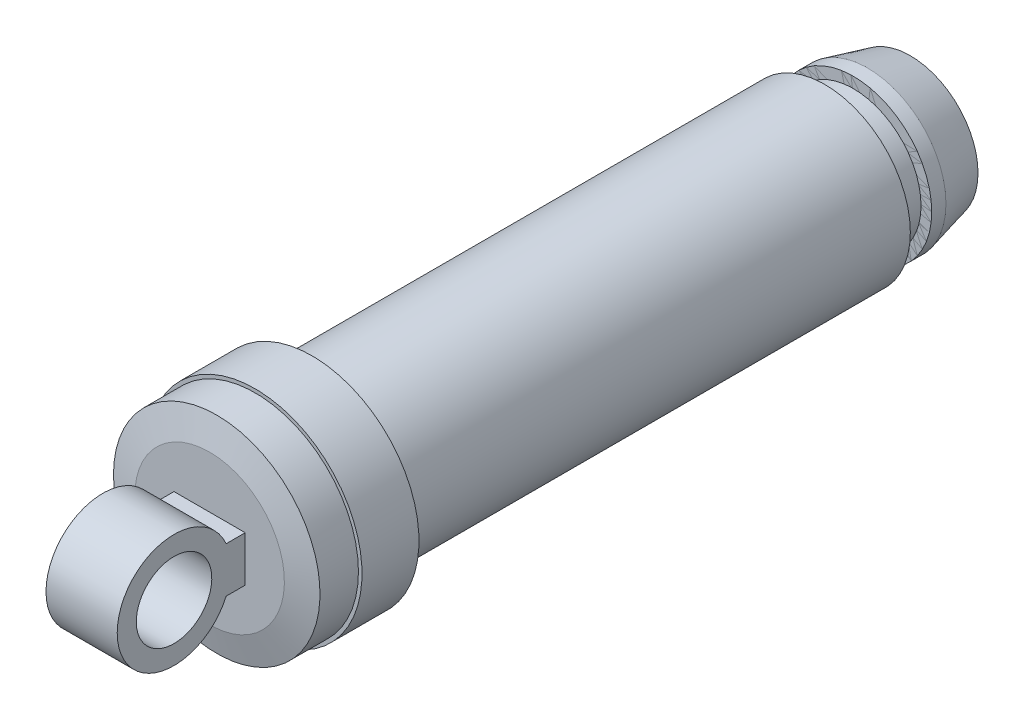
ISO-10303-21;
HEADER;
FILE_DESCRIPTION(('STEP AP214'),'2;1');
FILE_NAME('part.step','',(''),(''),'','','');
FILE_SCHEMA(('AUTOMOTIVE_DESIGN { 1 0 10303 214 1 1 1 1 }'));
ENDSEC;
DATA;
#1=APPLICATION_CONTEXT('core data for automotive mechanical design processes');
#2=APPLICATION_PROTOCOL_DEFINITION('international standard','automotive_design',2000,#1);
#3=PRODUCT_CONTEXT('',#1,'mechanical');
#4=PRODUCT('Part','Part','',(#3));
#5=PRODUCT_RELATED_PRODUCT_CATEGORY('part','',(#4));
#6=PRODUCT_DEFINITION_FORMATION('','',#4);
#7=PRODUCT_DEFINITION_CONTEXT('part definition',#1,'design');
#8=PRODUCT_DEFINITION('design','',#6,#7);
#9=PRODUCT_DEFINITION_SHAPE('','',#8);
#10=(LENGTH_UNIT() NAMED_UNIT(*) SI_UNIT(.MILLI.,.METRE.));
#11=(NAMED_UNIT(*) PLANE_ANGLE_UNIT() SI_UNIT($,.RADIAN.));
#12=(NAMED_UNIT(*) SI_UNIT($,.STERADIAN.) SOLID_ANGLE_UNIT());
#13=UNCERTAINTY_MEASURE_WITH_UNIT(LENGTH_MEASURE(1.E-05),#10,'distance_accuracy_value','');
#14=(GEOMETRIC_REPRESENTATION_CONTEXT(3) GLOBAL_UNCERTAINTY_ASSIGNED_CONTEXT((#13)) GLOBAL_UNIT_ASSIGNED_CONTEXT((#10,
#11,#12)) REPRESENTATION_CONTEXT('',''));
#15=CARTESIAN_POINT('',(0.,0.,0.));
#16=DIRECTION('',(0.,0.,1.));
#17=DIRECTION('',(1.,0.,0.));
#18=AXIS2_PLACEMENT_3D('',#15,#16,#17);
#19=CARTESIAN_POINT('',(-2.5,0.,12.1973316776032));
#20=DIRECTION('',(1.,0.,0.));
#21=DIRECTION('',(0.,1.,0.));
#22=AXIS2_PLACEMENT_3D('',#19,#20,#21);
#23=CYLINDRICAL_SURFACE('',#22,2.65);
#24=CARTESIAN_POINT('',(-2.5,0.,12.1973316776032));
#25=DIRECTION('',(1.,0.,0.));
#26=DIRECTION('',(0.,1.,0.));
#27=AXIS2_PLACEMENT_3D('',#24,#25,#26);
#28=CIRCLE('',#27,2.65);
#29=CARTESIAN_POINT('',(-2.5,2.65,12.1973316776032));
#30=VERTEX_POINT('',#29);
#31=EDGE_CURVE('P0_E20',#30,#30,#28,.F.);
#32=ORIENTED_EDGE('',*,*,#31,.T.);
#33=EDGE_LOOP('',(#32));
#34=FACE_BOUND('',#33,.T.);
#35=CARTESIAN_POINT('',(2.5,0.,12.1973316776032));
#36=DIRECTION('',(1.,0.,0.));
#37=DIRECTION('',(0.,1.,0.));
#38=AXIS2_PLACEMENT_3D('',#35,#36,#37);
#39=CIRCLE('',#38,2.65);
#40=CARTESIAN_POINT('',(2.5,2.65,12.1973316776032));
#41=VERTEX_POINT('',#40);
#42=EDGE_CURVE('P0_E75',#41,#41,#39,.T.);
#43=ORIENTED_EDGE('',*,*,#42,.T.);
#44=EDGE_LOOP('',(#43));
#45=FACE_BOUND('',#44,.T.);
#46=ADVANCED_FACE('P0_F17',(#34,#45),#23,.F.);
#47=CARTESIAN_POINT('',(-2.5,0.,12.1973316776032));
#48=DIRECTION('',(1.,0.,0.));
#49=DIRECTION('',(0.,0.,-1.));
#50=AXIS2_PLACEMENT_3D('',#47,#48,#49);
#51=CYLINDRICAL_SURFACE('',#50,3.99);
#52=CARTESIAN_POINT('',(-2.5,0.,12.1973316776032));
#53=DIRECTION('',(1.,0.,0.));
#54=DIRECTION('',(0.,0.,-1.));
#55=AXIS2_PLACEMENT_3D('',#52,#53,#54);
#56=CIRCLE('',#55,3.99);
#57=CARTESIAN_POINT('',(-2.5,1.595,8.54));
#58=VERTEX_POINT('',#57);
#59=CARTESIAN_POINT('',(-2.5,-1.595,8.54));
#60=VERTEX_POINT('',#59);
#61=EDGE_CURVE('P0_E58',#58,#60,#56,.T.);
#62=ORIENTED_EDGE('',*,*,#61,.T.);
#63=DIRECTION('',(1.,0.,0.));
#64=VECTOR('',#63,1.);
#65=CARTESIAN_POINT('',(-2.5,-1.595,8.54));
#66=LINE('',#65,#64);
#67=CARTESIAN_POINT('',(2.5,-1.595,8.54));
#68=VERTEX_POINT('',#67);
#69=EDGE_CURVE('P0_E62',#60,#68,#66,.T.);
#70=ORIENTED_EDGE('',*,*,#69,.T.);
#71=CARTESIAN_POINT('',(2.5,0.,12.1973316776032));
#72=DIRECTION('',(1.,0.,0.));
#73=DIRECTION('',(0.,0.,-1.));
#74=AXIS2_PLACEMENT_3D('',#71,#72,#73);
#75=CIRCLE('',#74,3.99);
#76=CARTESIAN_POINT('',(2.5,1.595,8.54));
#77=VERTEX_POINT('',#76);
#78=EDGE_CURVE('P0_E127',#68,#77,#75,.F.);
#79=ORIENTED_EDGE('',*,*,#78,.T.);
#80=DIRECTION('',(1.,0.,0.));
#81=VECTOR('',#80,1.);
#82=CARTESIAN_POINT('',(-2.5,1.595,8.54));
#83=LINE('',#82,#81);
#84=EDGE_CURVE('P0_E55',#77,#58,#83,.F.);
#85=ORIENTED_EDGE('',*,*,#84,.T.);
#86=EDGE_LOOP('',(#62,#70,#79,#85));
#87=FACE_BOUND('',#86,.T.);
#88=ADVANCED_FACE('P0_F60',(#87),#51,.T.);
#89=CARTESIAN_POINT('',(0.,0.,0.));
#90=DIRECTION('',(0.,0.,-1.));
#91=DIRECTION('',(-1.,0.,0.));
#92=AXIS2_PLACEMENT_3D('',#89,#90,#91);
#93=PLANE('',#92);
#94=CARTESIAN_POINT('',(0.,0.,0.));
#95=DIRECTION('',(0.,0.,-1.));
#96=DIRECTION('',(-1.,0.,0.));
#97=AXIS2_PLACEMENT_3D('',#94,#95,#96);
#98=CIRCLE('',#97,3.5);
#99=CARTESIAN_POINT('',(-3.5,0.,0.));
#100=VERTEX_POINT('',#99);
#101=EDGE_CURVE('P0_E123',#100,#100,#98,.T.);
#102=ORIENTED_EDGE('',*,*,#101,.T.);
#103=EDGE_LOOP('',(#102));
#104=FACE_BOUND('',#103,.T.);
#105=ADVANCED_FACE('P0_F165',(#104),#93,.T.);
#106=CARTESIAN_POINT('',(-2.5,1.595,8.54));
#107=DIRECTION('',(0.,-1.,0.));
#108=DIRECTION('',(0.,0.,-1.));
#109=AXIS2_PLACEMENT_3D('',#106,#107,#108);
#110=PLANE('',#109);
#111=DIRECTION('',(0.,0.,1.));
#112=VECTOR('',#111,1.);
#113=CARTESIAN_POINT('',(-2.5,1.595,8.54));
#114=LINE('',#113,#112);
#115=CARTESIAN_POINT('',(-2.5,1.595,7.2));
#116=VERTEX_POINT('',#115);
#117=EDGE_CURVE('P0_E66',#116,#58,#114,.T.);
#118=ORIENTED_EDGE('',*,*,#117,.T.);
#119=ORIENTED_EDGE('',*,*,#84,.F.);
#120=DIRECTION('',(0.,0.,1.));
#121=VECTOR('',#120,1.);
#122=CARTESIAN_POINT('',(2.5,1.595,8.54));
#123=LINE('',#122,#121);
#124=CARTESIAN_POINT('',(2.5,1.595,7.2));
#125=VERTEX_POINT('',#124);
#126=EDGE_CURVE('P0_E126',#77,#125,#123,.F.);
#127=ORIENTED_EDGE('',*,*,#126,.T.);
#128=DIRECTION('',(-1.,0.,0.));
#129=VECTOR('',#128,1.);
#130=CARTESIAN_POINT('',(0.,1.595,7.2));
#131=LINE('',#130,#129);
#132=EDGE_CURVE('P0_E90',#125,#116,#131,.T.);
#133=ORIENTED_EDGE('',*,*,#132,.T.);
#134=EDGE_LOOP('',(#118,#119,#127,#133));
#135=FACE_BOUND('',#134,.T.);
#136=ADVANCED_FACE('P0_F145',(#135),#110,.F.);
#137=CARTESIAN_POINT('',(-2.5,1.595,8.54));
#138=DIRECTION('',(1.,0.,0.));
#139=DIRECTION('',(0.,1.,0.));
#140=AXIS2_PLACEMENT_3D('',#137,#138,#139);
#141=PLANE('',#140);
#142=DIRECTION('',(0.,0.,1.));
#143=VECTOR('',#142,1.);
#144=CARTESIAN_POINT('',(-2.5,-1.595,8.54));
#145=LINE('',#144,#143);
#146=CARTESIAN_POINT('',(-2.5,-1.595,7.2));
#147=VERTEX_POINT('',#146);
#148=EDGE_CURVE('P0_E65',#147,#60,#145,.T.);
#149=ORIENTED_EDGE('',*,*,#148,.T.);
#150=ORIENTED_EDGE('',*,*,#61,.F.);
#151=ORIENTED_EDGE('',*,*,#117,.F.);
#152=DIRECTION('',(0.,1.,0.));
#153=VECTOR('',#152,1.);
#154=CARTESIAN_POINT('',(-2.5,0.,7.2));
#155=LINE('',#154,#153);
#156=EDGE_CURVE('P0_E70',#116,#147,#155,.F.);
#157=ORIENTED_EDGE('',*,*,#156,.T.);
#158=EDGE_LOOP('',(#149,#150,#151,#157));
#159=FACE_BOUND('',#158,.T.);
#160=ORIENTED_EDGE('',*,*,#31,.F.);
#161=EDGE_LOOP('',(#160));
#162=FACE_BOUND('',#161,.T.);
#163=ADVANCED_FACE('P0_F67',(#159,#162),#141,.F.);
#164=CARTESIAN_POINT('',(-2.5,-1.595,8.54));
#165=DIRECTION('',(0.,1.,0.));
#166=DIRECTION('',(0.,0.,1.));
#167=AXIS2_PLACEMENT_3D('',#164,#165,#166);
#168=PLANE('',#167);
#169=DIRECTION('',(0.,0.,1.));
#170=VECTOR('',#169,1.);
#171=CARTESIAN_POINT('',(2.5,-1.595,8.54));
#172=LINE('',#171,#170);
#173=CARTESIAN_POINT('',(2.5,-1.595,7.2));
#174=VERTEX_POINT('',#173);
#175=EDGE_CURVE('P0_E73',#174,#68,#172,.T.);
#176=ORIENTED_EDGE('',*,*,#175,.T.);
#177=ORIENTED_EDGE('',*,*,#69,.F.);
#178=ORIENTED_EDGE('',*,*,#148,.F.);
#179=DIRECTION('',(-1.,0.,0.));
#180=VECTOR('',#179,1.);
#181=CARTESIAN_POINT('',(0.,-1.595,7.2));
#182=LINE('',#181,#180);
#183=EDGE_CURVE('P0_E35',#147,#174,#182,.F.);
#184=ORIENTED_EDGE('',*,*,#183,.T.);
#185=EDGE_LOOP('',(#176,#177,#178,#184));
#186=FACE_BOUND('',#185,.T.);
#187=ADVANCED_FACE('P0_F72',(#186),#168,.F.);
#188=CARTESIAN_POINT('',(2.5,1.595,8.54));
#189=DIRECTION('',(-1.,0.,0.));
#190=DIRECTION('',(0.,-1.,0.));
#191=AXIS2_PLACEMENT_3D('',#188,#189,#190);
#192=PLANE('',#191);
#193=ORIENTED_EDGE('',*,*,#126,.F.);
#194=ORIENTED_EDGE('',*,*,#78,.F.);
#195=ORIENTED_EDGE('',*,*,#175,.F.);
#196=DIRECTION('',(0.,1.,0.));
#197=VECTOR('',#196,1.);
#198=CARTESIAN_POINT('',(2.5,0.,7.2));
#199=LINE('',#198,#197);
#200=EDGE_CURVE('P0_E84',#174,#125,#199,.T.);
#201=ORIENTED_EDGE('',*,*,#200,.T.);
#202=EDGE_LOOP('',(#193,#194,#195,#201));
#203=FACE_BOUND('',#202,.T.);
#204=ORIENTED_EDGE('',*,*,#42,.F.);
#205=EDGE_LOOP('',(#204));
#206=FACE_BOUND('',#205,.T.);
#207=ADVANCED_FACE('P0_F152',(#203,#206),#192,.F.);
#208=CARTESIAN_POINT('',(0.,0.,0.));
#209=DIRECTION('',(0.,0.,-1.));
#210=DIRECTION('',(-1.,0.,0.));
#211=AXIS2_PLACEMENT_3D('',#208,#209,#210);
#212=CYLINDRICAL_SURFACE('',#211,3.5);
#213=CARTESIAN_POINT('',(0.,0.,-39.));
#214=DIRECTION('',(0.,0.,-1.));
#215=DIRECTION('',(-1.,0.,0.));
#216=AXIS2_PLACEMENT_3D('',#213,#214,#215);
#217=CIRCLE('',#216,3.5);
#218=CARTESIAN_POINT('',(-3.5,0.,-39.));
#219=VERTEX_POINT('',#218);
#220=EDGE_CURVE('P0_E120',#219,#219,#217,.F.);
#221=ORIENTED_EDGE('',*,*,#220,.F.);
#222=EDGE_LOOP('',(#221));
#223=FACE_BOUND('',#222,.T.);
#224=ORIENTED_EDGE('',*,*,#101,.F.);
#225=EDGE_LOOP('',(#224));
#226=FACE_BOUND('',#225,.T.);
#227=ADVANCED_FACE('P0_F155',(#223,#226),#212,.F.);
#228=CARTESIAN_POINT('',(0.,0.,7.2));
#229=DIRECTION('',(0.,0.,-1.));
#230=DIRECTION('',(-1.,0.,0.));
#231=AXIS2_PLACEMENT_3D('',#228,#229,#230);
#232=PLANE('',#231);
#233=ORIENTED_EDGE('',*,*,#183,.F.);
#234=ORIENTED_EDGE('',*,*,#156,.F.);
#235=ORIENTED_EDGE('',*,*,#132,.F.);
#236=ORIENTED_EDGE('',*,*,#200,.F.);
#237=EDGE_LOOP('',(#233,#234,#235,#236));
#238=FACE_BOUND('',#237,.T.);
#239=CARTESIAN_POINT('',(0.,0.,7.19999999999743));
#240=DIRECTION('',(0.,0.,-1.));
#241=DIRECTION('',(0.,1.,0.));
#242=AXIS2_PLACEMENT_3D('',#239,#240,#241);
#243=CIRCLE('',#242,5.25000000004638);
#244=CARTESIAN_POINT('',(0.,5.25000000004638,7.19999999999743));
#245=VERTEX_POINT('',#244);
#246=EDGE_CURVE('P0_E117',#245,#245,#243,.T.);
#247=ORIENTED_EDGE('',*,*,#246,.F.);
#248=EDGE_LOOP('',(#247));
#249=FACE_BOUND('',#248,.T.);
#250=ADVANCED_FACE('P0_F149',(#238,#249),#232,.F.);
#251=CARTESIAN_POINT('',(0.,0.,-39.));
#252=DIRECTION('',(0.,0.,-1.));
#253=DIRECTION('',(-1.,0.,0.));
#254=AXIS2_PLACEMENT_3D('',#251,#252,#253);
#255=PLANE('',#254);
#256=CARTESIAN_POINT('',(0.,0.,-39.));
#257=DIRECTION('',(0.,0.,1.));
#258=DIRECTION('',(1.,0.,0.));
#259=AXIS2_PLACEMENT_3D('',#256,#257,#258);
#260=CIRCLE('',#259,5.5);
#261=CARTESIAN_POINT('',(5.5,0.,-39.));
#262=VERTEX_POINT('',#261);
#263=EDGE_CURVE('P0_E114',#262,#262,#260,.T.);
#264=ORIENTED_EDGE('',*,*,#263,.F.);
#265=EDGE_LOOP('',(#264));
#266=FACE_BOUND('',#265,.T.);
#267=ORIENTED_EDGE('',*,*,#220,.T.);
#268=EDGE_LOOP('',(#267));
#269=FACE_BOUND('',#268,.T.);
#270=ADVANCED_FACE('P0_F210',(#266,#269),#255,.T.);
#271=CARTESIAN_POINT('',(0.,0.,6.70000000002346));
#272=DIRECTION('',(0.,0.,-1.));
#273=DIRECTION('',(0.,1.,0.));
#274=AXIS2_PLACEMENT_3D('',#271,#272,#273);
#275=CONICAL_SURFACE('',#274,7.24999999994225,1.32581766366803);
#276=CARTESIAN_POINT('',(0.,0.,6.7));
#277=DIRECTION('',(0.,0.,-1.));
#278=DIRECTION('',(-1.,0.,0.));
#279=AXIS2_PLACEMENT_3D('',#276,#277,#278);
#280=CIRCLE('',#279,7.25);
#281=CARTESIAN_POINT('',(-7.25,0.,6.7));
#282=VERTEX_POINT('',#281);
#283=EDGE_CURVE('P0_E113',#282,#282,#280,.T.);
#284=ORIENTED_EDGE('',*,*,#283,.F.);
#285=EDGE_LOOP('',(#284));
#286=FACE_BOUND('',#285,.T.);
#287=ORIENTED_EDGE('',*,*,#246,.T.);
#288=EDGE_LOOP('',(#287));
#289=FACE_BOUND('',#288,.T.);
#290=ADVANCED_FACE('P0_F206',(#286,#289),#275,.T.);
#291=CARTESIAN_POINT('',(0.,0.,-39.));
#292=DIRECTION('',(0.,0.,1.));
#293=DIRECTION('',(1.,0.,0.));
#294=AXIS2_PLACEMENT_3D('',#291,#292,#293);
#295=CYLINDRICAL_SURFACE('',#294,5.5);
#296=ORIENTED_EDGE('',*,*,#263,.T.);
#297=EDGE_LOOP('',(#296));
#298=FACE_BOUND('',#297,.T.);
#299=CARTESIAN_POINT('',(0.,0.,-38.));
#300=DIRECTION('',(0.,0.,1.));
#301=DIRECTION('',(1.,0.,0.));
#302=AXIS2_PLACEMENT_3D('',#299,#300,#301);
#303=CIRCLE('',#302,5.5);
#304=CARTESIAN_POINT('',(5.5,0.,-38.));
#305=VERTEX_POINT('',#304);
#306=EDGE_CURVE('P0_E110',#305,#305,#303,.F.);
#307=ORIENTED_EDGE('',*,*,#306,.T.);
#308=EDGE_LOOP('',(#307));
#309=FACE_BOUND('',#308,.T.);
#310=ADVANCED_FACE('P0_F202',(#298,#309),#295,.T.);
#311=CARTESIAN_POINT('',(0.,0.,6.7));
#312=DIRECTION('',(0.,0.,-1.));
#313=DIRECTION('',(-1.,0.,0.));
#314=AXIS2_PLACEMENT_3D('',#311,#312,#313);
#315=CYLINDRICAL_SURFACE('',#314,7.25);
#316=CARTESIAN_POINT('',(0.,0.,4.));
#317=DIRECTION('',(0.,0.,-1.));
#318=DIRECTION('',(-1.,0.,0.));
#319=AXIS2_PLACEMENT_3D('',#316,#317,#318);
#320=CIRCLE('',#319,7.25);
#321=CARTESIAN_POINT('',(-7.25,0.,4.));
#322=VERTEX_POINT('',#321);
#323=EDGE_CURVE('P0_E107',#322,#322,#320,.T.);
#324=ORIENTED_EDGE('',*,*,#323,.F.);
#325=EDGE_LOOP('',(#324));
#326=FACE_BOUND('',#325,.T.);
#327=ORIENTED_EDGE('',*,*,#283,.T.);
#328=EDGE_LOOP('',(#327));
#329=FACE_BOUND('',#328,.T.);
#330=ADVANCED_FACE('P0_F198',(#326,#329),#315,.T.);
#331=CARTESIAN_POINT('',(0.,0.,-38.));
#332=DIRECTION('',(0.,0.,-1.));
#333=DIRECTION('',(-1.,0.,0.));
#334=AXIS2_PLACEMENT_3D('',#331,#332,#333);
#335=PLANE('',#334);
#336=CARTESIAN_POINT('',(0.,0.,-38.));
#337=DIRECTION('',(0.,0.,1.));
#338=DIRECTION('',(1.,0.,0.));
#339=AXIS2_PLACEMENT_3D('',#336,#337,#338);
#340=CIRCLE('',#339,4.75);
#341=CARTESIAN_POINT('',(4.75,0.,-38.));
#342=VERTEX_POINT('',#341);
#343=EDGE_CURVE('P0_E104',#342,#342,#340,.T.);
#344=ORIENTED_EDGE('',*,*,#343,.F.);
#345=EDGE_LOOP('',(#344));
#346=FACE_BOUND('',#345,.T.);
#347=ORIENTED_EDGE('',*,*,#306,.F.);
#348=EDGE_LOOP('',(#347));
#349=FACE_BOUND('',#348,.T.);
#350=ADVANCED_FACE('P0_F194',(#346,#349),#335,.F.);
#351=CARTESIAN_POINT('',(0.,0.,4.));
#352=DIRECTION('',(0.,0.,1.));
#353=DIRECTION('',(1.,0.,0.));
#354=AXIS2_PLACEMENT_3D('',#351,#352,#353);
#355=PLANE('',#354);
#356=ORIENTED_EDGE('',*,*,#323,.T.);
#357=EDGE_LOOP('',(#356));
#358=FACE_BOUND('',#357,.T.);
#359=CARTESIAN_POINT('',(0.,0.,4.));
#360=DIRECTION('',(0.,0.,-1.));
#361=DIRECTION('',(-1.,0.,0.));
#362=AXIS2_PLACEMENT_3D('',#359,#360,#361);
#363=CIRCLE('',#362,7.5);
#364=CARTESIAN_POINT('',(-7.5,0.,4.));
#365=VERTEX_POINT('',#364);
#366=EDGE_CURVE('P0_E101',#365,#365,#363,.T.);
#367=ORIENTED_EDGE('',*,*,#366,.F.);
#368=EDGE_LOOP('',(#367));
#369=FACE_BOUND('',#368,.T.);
#370=ADVANCED_FACE('P0_F190',(#358,#369),#355,.T.);
#371=CARTESIAN_POINT('',(0.,0.,-38.));
#372=DIRECTION('',(0.,0.,1.));
#373=DIRECTION('',(1.,0.,0.));
#374=AXIS2_PLACEMENT_3D('',#371,#372,#373);
#375=CYLINDRICAL_SURFACE('',#374,4.75);
#376=CARTESIAN_POINT('',(0.,0.,-36.));
#377=DIRECTION('',(0.,0.,1.));
#378=DIRECTION('',(1.,0.,0.));
#379=AXIS2_PLACEMENT_3D('',#376,#377,#378);
#380=CIRCLE('',#379,4.75);
#381=CARTESIAN_POINT('',(4.75,0.,-36.));
#382=VERTEX_POINT('',#381);
#383=EDGE_CURVE('P0_E98',#382,#382,#380,.T.);
#384=ORIENTED_EDGE('',*,*,#383,.F.);
#385=EDGE_LOOP('',(#384));
#386=FACE_BOUND('',#385,.T.);
#387=ORIENTED_EDGE('',*,*,#343,.T.);
#388=EDGE_LOOP('',(#387));
#389=FACE_BOUND('',#388,.T.);
#390=ADVANCED_FACE('P0_F186',(#386,#389),#375,.T.);
#391=CARTESIAN_POINT('',(0.,0.,4.));
#392=DIRECTION('',(0.,0.,-1.));
#393=DIRECTION('',(-1.,0.,0.));
#394=AXIS2_PLACEMENT_3D('',#391,#392,#393);
#395=CYLINDRICAL_SURFACE('',#394,7.5);
#396=ORIENTED_EDGE('',*,*,#366,.T.);
#397=EDGE_LOOP('',(#396));
#398=FACE_BOUND('',#397,.T.);
#399=CARTESIAN_POINT('',(0.,0.,0.));
#400=DIRECTION('',(0.,0.,-1.));
#401=DIRECTION('',(-1.,0.,0.));
#402=AXIS2_PLACEMENT_3D('',#399,#400,#401);
#403=CIRCLE('',#402,7.5);
#404=CARTESIAN_POINT('',(-7.5,0.,0.));
#405=VERTEX_POINT('',#404);
#406=EDGE_CURVE('P0_E95',#405,#405,#403,.F.);
#407=ORIENTED_EDGE('',*,*,#406,.T.);
#408=EDGE_LOOP('',(#407));
#409=FACE_BOUND('',#408,.T.);
#410=ADVANCED_FACE('P0_F182',(#398,#409),#395,.T.);
#411=CARTESIAN_POINT('',(0.,0.,-36.));
#412=DIRECTION('',(0.,0.,-1.));
#413=DIRECTION('',(-1.,0.,0.));
#414=AXIS2_PLACEMENT_3D('',#411,#412,#413);
#415=PLANE('',#414);
#416=ORIENTED_EDGE('',*,*,#383,.T.);
#417=EDGE_LOOP('',(#416));
#418=FACE_BOUND('',#417,.T.);
#419=CARTESIAN_POINT('',(0.,0.,-36.));
#420=DIRECTION('',(0.,0.,1.));
#421=DIRECTION('',(1.,0.,0.));
#422=AXIS2_PLACEMENT_3D('',#419,#420,#421);
#423=CIRCLE('',#422,6.);
#424=CARTESIAN_POINT('',(6.,0.,-36.));
#425=VERTEX_POINT('',#424);
#426=EDGE_CURVE('P0_E26',#425,#425,#423,.T.);
#427=ORIENTED_EDGE('',*,*,#426,.F.);
#428=EDGE_LOOP('',(#427));
#429=FACE_BOUND('',#428,.T.);
#430=ADVANCED_FACE('P0_F175',(#418,#429),#415,.T.);
#431=CARTESIAN_POINT('',(0.,0.,0.));
#432=DIRECTION('',(0.,0.,1.));
#433=DIRECTION('',(1.,0.,0.));
#434=AXIS2_PLACEMENT_3D('',#431,#432,#433);
#435=PLANE('',#434);
#436=CARTESIAN_POINT('',(0.,0.,0.));
#437=DIRECTION('',(0.,0.,1.));
#438=DIRECTION('',(1.,0.,0.));
#439=AXIS2_PLACEMENT_3D('',#436,#437,#438);
#440=CIRCLE('',#439,6.);
#441=CARTESIAN_POINT('',(6.,0.,0.));
#442=VERTEX_POINT('',#441);
#443=EDGE_CURVE('P0_E11',#442,#442,#440,.F.);
#444=ORIENTED_EDGE('',*,*,#443,.F.);
#445=EDGE_LOOP('',(#444));
#446=FACE_BOUND('',#445,.T.);
#447=ORIENTED_EDGE('',*,*,#406,.F.);
#448=EDGE_LOOP('',(#447));
#449=FACE_BOUND('',#448,.T.);
#450=ADVANCED_FACE('P0_F169',(#446,#449),#435,.F.);
#451=CARTESIAN_POINT('',(0.,0.,-36.));
#452=DIRECTION('',(0.,0.,1.));
#453=DIRECTION('',(1.,0.,0.));
#454=AXIS2_PLACEMENT_3D('',#451,#452,#453);
#455=CYLINDRICAL_SURFACE('',#454,6.);
#456=ORIENTED_EDGE('',*,*,#443,.T.);
#457=EDGE_LOOP('',(#456));
#458=FACE_BOUND('',#457,.T.);
#459=ORIENTED_EDGE('',*,*,#426,.T.);
#460=EDGE_LOOP('',(#459));
#461=FACE_BOUND('',#460,.T.);
#462=ADVANCED_FACE('P0_F167',(#458,#461),#455,.T.);
#463=CLOSED_SHELL('',(#46,#88,#105,#136,#163,#187,#207,#227,#250,#270,#290,#310,#330,#350,#370,
#390,#410,#430,#450,#462));
#464=MANIFOLD_SOLID_BREP('P0_B1',#463);
#465=CARTESIAN_POINT('',(0.,0.,-42.));
#466=DIRECTION('',(0.,0.,1.));
#467=DIRECTION('',(1.,0.,0.));
#468=AXIS2_PLACEMENT_3D('',#465,#466,#467);
#469=PLANE('',#468);
#470=CARTESIAN_POINT('',(0.,0.,-41.9999999999732));
#471=DIRECTION('',(0.,0.,1.));
#472=DIRECTION('',(1.,0.,0.));
#473=AXIS2_PLACEMENT_3D('',#470,#471,#472);
#474=CIRCLE('',#473,4.75000000000136);
#475=CARTESIAN_POINT('',(4.75000000000136,0.,-41.9999999999732));
#476=VERTEX_POINT('',#475);
#477=EDGE_CURVE('P1_E18',#476,#476,#474,.T.);
#478=ORIENTED_EDGE('',*,*,#477,.F.);
#479=EDGE_LOOP('',(#478));
#480=FACE_BOUND('',#479,.T.);
#481=CARTESIAN_POINT('',(0.,0.,-42.));
#482=DIRECTION('',(0.,0.,-1.));
#483=DIRECTION('',(-1.,0.,0.));
#484=AXIS2_PLACEMENT_3D('',#481,#482,#483);
#485=CIRCLE('',#484,3.5);
#486=CARTESIAN_POINT('',(-3.5,0.,-42.));
#487=VERTEX_POINT('',#486);
#488=EDGE_CURVE('P1_E30',#487,#487,#485,.F.);
#489=ORIENTED_EDGE('',*,*,#488,.T.);
#490=EDGE_LOOP('',(#489));
#491=FACE_BOUND('',#490,.T.);
#492=ADVANCED_FACE('P1_F15',(#480,#491),#469,.F.);
#493=CARTESIAN_POINT('',(0.,0.,-39.0000000001578));
#494=DIRECTION('',(0.,0.,1.));
#495=DIRECTION('',(1.,0.,0.));
#496=AXIS2_PLACEMENT_3D('',#493,#494,#495);
#497=CONICAL_SURFACE('',#496,5.49999999995521,0.244978663126864);
#498=ORIENTED_EDGE('',*,*,#477,.T.);
#499=EDGE_LOOP('',(#498));
#500=FACE_BOUND('',#499,.T.);
#501=CARTESIAN_POINT('',(0.,0.,-39.));
#502=DIRECTION('',(0.,0.,1.));
#503=DIRECTION('',(1.,0.,0.));
#504=AXIS2_PLACEMENT_3D('',#501,#502,#503);
#505=CIRCLE('',#504,5.5);
#506=CARTESIAN_POINT('',(5.5,0.,-39.));
#507=VERTEX_POINT('',#506);
#508=EDGE_CURVE('P1_E27',#507,#507,#505,.T.);
#509=ORIENTED_EDGE('',*,*,#508,.F.);
#510=EDGE_LOOP('',(#509));
#511=FACE_BOUND('',#510,.T.);
#512=ADVANCED_FACE('P1_F38',(#500,#511),#497,.T.);
#513=CARTESIAN_POINT('',(0.,0.,0.));
#514=DIRECTION('',(0.,0.,-1.));
#515=DIRECTION('',(-1.,0.,0.));
#516=AXIS2_PLACEMENT_3D('',#513,#514,#515);
#517=CYLINDRICAL_SURFACE('',#516,3.5);
#518=CARTESIAN_POINT('',(0.,0.,-38.));
#519=DIRECTION('',(0.,0.,-1.));
#520=DIRECTION('',(-1.,0.,0.));
#521=AXIS2_PLACEMENT_3D('',#518,#519,#520);
#522=CIRCLE('',#521,3.5);
#523=CARTESIAN_POINT('',(-3.5,0.,-38.));
#524=VERTEX_POINT('',#523);
#525=EDGE_CURVE('P1_E22',#524,#524,#522,.F.);
#526=ORIENTED_EDGE('',*,*,#525,.T.);
#527=EDGE_LOOP('',(#526));
#528=FACE_BOUND('',#527,.T.);
#529=ORIENTED_EDGE('',*,*,#488,.F.);
#530=EDGE_LOOP('',(#529));
#531=FACE_BOUND('',#530,.T.);
#532=ADVANCED_FACE('P1_F46',(#528,#531),#517,.F.);
#533=CARTESIAN_POINT('',(0.,0.,-39.));
#534=DIRECTION('',(0.,0.,1.));
#535=DIRECTION('',(1.,0.,0.));
#536=AXIS2_PLACEMENT_3D('',#533,#534,#535);
#537=CYLINDRICAL_SURFACE('',#536,5.5);
#538=ORIENTED_EDGE('',*,*,#508,.T.);
#539=EDGE_LOOP('',(#538));
#540=FACE_BOUND('',#539,.T.);
#541=CARTESIAN_POINT('',(0.,0.,-38.));
#542=DIRECTION('',(0.,0.,1.));
#543=DIRECTION('',(1.,0.,0.));
#544=AXIS2_PLACEMENT_3D('',#541,#542,#543);
#545=CIRCLE('',#544,5.5);
#546=CARTESIAN_POINT('',(5.5,0.,-38.));
#547=VERTEX_POINT('',#546);
#548=EDGE_CURVE('P1_E10',#547,#547,#545,.F.);
#549=ORIENTED_EDGE('',*,*,#548,.T.);
#550=EDGE_LOOP('',(#549));
#551=FACE_BOUND('',#550,.T.);
#552=ADVANCED_FACE('P1_F49',(#540,#551),#537,.T.);
#553=CARTESIAN_POINT('',(0.,0.,-38.));
#554=DIRECTION('',(0.,0.,-1.));
#555=DIRECTION('',(-1.,0.,0.));
#556=AXIS2_PLACEMENT_3D('',#553,#554,#555);
#557=PLANE('',#556);
#558=ORIENTED_EDGE('',*,*,#548,.F.);
#559=EDGE_LOOP('',(#558));
#560=FACE_BOUND('',#559,.T.);
#561=ORIENTED_EDGE('',*,*,#525,.F.);
#562=EDGE_LOOP('',(#561));
#563=FACE_BOUND('',#562,.T.);
#564=ADVANCED_FACE('P1_F47',(#560,#563),#557,.F.);
#565=CLOSED_SHELL('',(#492,#512,#532,#552,#564));
#566=MANIFOLD_SOLID_BREP('P1_B1',#565);
#567=ADVANCED_BREP_SHAPE_REPRESENTATION('',(#18,#464,#566),#14);
#568=SHAPE_DEFINITION_REPRESENTATION(#9,#567);
ENDSEC;
END-ISO-10303-21;
